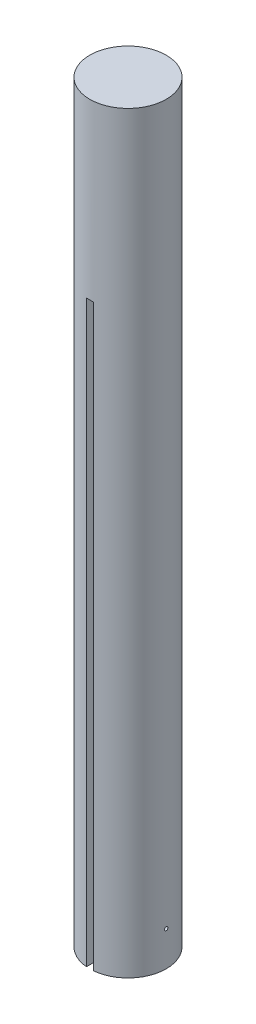
ISO-10303-21;
HEADER;
FILE_DESCRIPTION(('STEP AP214'),'2;1');
FILE_NAME('part.step','',(''),(''),'','','');
FILE_SCHEMA(('AUTOMOTIVE_DESIGN { 1 0 10303 214 1 1 1 1 }'));
ENDSEC;
DATA;
#1=APPLICATION_CONTEXT('core data for automotive mechanical design processes');
#2=APPLICATION_PROTOCOL_DEFINITION('international standard','automotive_design',2000,#1);
#3=PRODUCT_CONTEXT('',#1,'mechanical');
#4=PRODUCT('Part','Part','',(#3));
#5=PRODUCT_RELATED_PRODUCT_CATEGORY('part','',(#4));
#6=PRODUCT_DEFINITION_FORMATION('','',#4);
#7=PRODUCT_DEFINITION_CONTEXT('part definition',#1,'design');
#8=PRODUCT_DEFINITION('design','',#6,#7);
#9=PRODUCT_DEFINITION_SHAPE('','',#8);
#10=(LENGTH_UNIT() NAMED_UNIT(*) SI_UNIT(.MILLI.,.METRE.));
#11=(NAMED_UNIT(*) PLANE_ANGLE_UNIT() SI_UNIT($,.RADIAN.));
#12=(NAMED_UNIT(*) SI_UNIT($,.STERADIAN.) SOLID_ANGLE_UNIT());
#13=UNCERTAINTY_MEASURE_WITH_UNIT(LENGTH_MEASURE(1.E-05),#10,'distance_accuracy_value','');
#14=(GEOMETRIC_REPRESENTATION_CONTEXT(3) GLOBAL_UNCERTAINTY_ASSIGNED_CONTEXT((#13)) GLOBAL_UNIT_ASSIGNED_CONTEXT((#10,
#11,#12)) REPRESENTATION_CONTEXT('',''));
#15=CARTESIAN_POINT('',(0.,0.,0.));
#16=DIRECTION('',(0.,0.,1.));
#17=DIRECTION('',(1.,0.,0.));
#18=AXIS2_PLACEMENT_3D('',#15,#16,#17);
#19=CARTESIAN_POINT('',(0.,166.66667,0.));
#20=DIRECTION('',(0.,1.,0.));
#21=DIRECTION('',(0.,0.,1.));
#22=AXIS2_PLACEMENT_3D('',#19,#20,#21);
#23=PLANE('',#22);
#24=DIRECTION('',(0.,0.,-1.));
#25=VECTOR('',#24,1.);
#26=CARTESIAN_POINT('',(0.99999999999999,166.66667,0.));
#27=LINE('',#26,#25);
#28=CARTESIAN_POINT('',(0.99999999999999,166.66667,10.9544511501033));
#29=VERTEX_POINT('',#28);
#30=CARTESIAN_POINT('',(0.999999999999987,166.66667,-10.9544511501033));
#31=VERTEX_POINT('',#30);
#32=EDGE_CURVE('E11',#29,#31,#27,.T.);
#33=ORIENTED_EDGE('',*,*,#32,.F.);
#34=CARTESIAN_POINT('',(0.,166.66667,0.));
#35=DIRECTION('',(0.,1.,0.));
#36=DIRECTION('',(0.,0.,1.));
#37=AXIS2_PLACEMENT_3D('',#34,#35,#36);
#38=CIRCLE('',#37,11.);
#39=CARTESIAN_POINT('',(-1.00000000000001,166.66667,10.9544511501033));
#40=VERTEX_POINT('',#39);
#41=EDGE_CURVE('E144',#40,#29,#38,.T.);
#42=ORIENTED_EDGE('',*,*,#41,.F.);
#43=DIRECTION('',(0.,0.,-1.));
#44=VECTOR('',#43,1.);
#45=CARTESIAN_POINT('',(-1.00000000000001,166.66667,-11.));
#46=LINE('',#45,#44);
#47=CARTESIAN_POINT('',(-1.00000000000001,166.66667,-10.9544511501033));
#48=VERTEX_POINT('',#47);
#49=EDGE_CURVE('E55',#40,#48,#46,.T.);
#50=ORIENTED_EDGE('',*,*,#49,.T.);
#51=EDGE_CURVE('E67',#31,#48,#38,.T.);
#52=ORIENTED_EDGE('',*,*,#51,.F.);
#53=EDGE_LOOP('',(#33,#42,#50,#52));
#54=FACE_BOUND('',#53,.T.);
#55=ADVANCED_FACE('F45',(#54),#23,.F.);
#56=CARTESIAN_POINT('',(-1.00000000000001,216.66667,-11.));
#57=DIRECTION('',(-1.,0.,0.));
#58=DIRECTION('',(0.,-1.,0.));
#59=AXIS2_PLACEMENT_3D('',#56,#57,#58);
#60=PLANE('',#59);
#61=ORIENTED_EDGE('',*,*,#49,.F.);
#62=DIRECTION('',(0.,-1.,0.));
#63=VECTOR('',#62,1.);
#64=CARTESIAN_POINT('',(-1.00000000000001,216.66667,10.9544511501033));
#65=LINE('',#64,#63);
#66=CARTESIAN_POINT('',(-1.,0.,10.9544511501033));
#67=VERTEX_POINT('',#66);
#68=EDGE_CURVE('E158',#67,#40,#65,.F.);
#69=ORIENTED_EDGE('',*,*,#68,.F.);
#70=DIRECTION('',(0.,0.,1.));
#71=VECTOR('',#70,1.);
#72=CARTESIAN_POINT('',(-1.,0.,-11.));
#73=LINE('',#72,#71);
#74=CARTESIAN_POINT('',(-1.,0.,6.92820323027551));
#75=VERTEX_POINT('',#74);
#76=EDGE_CURVE('E147',#75,#67,#73,.T.);
#77=ORIENTED_EDGE('',*,*,#76,.F.);
#78=DIRECTION('',(0.,-1.,0.));
#79=VECTOR('',#78,1.);
#80=CARTESIAN_POINT('',(-1.,20.,6.92820323027551));
#81=LINE('',#80,#79);
#82=CARTESIAN_POINT('',(-1.,20.,6.92820323027551));
#83=VERTEX_POINT('',#82);
#84=EDGE_CURVE('E152',#75,#83,#81,.F.);
#85=ORIENTED_EDGE('',*,*,#84,.T.);
#86=DIRECTION('',(0.,0.,1.));
#87=VECTOR('',#86,1.);
#88=CARTESIAN_POINT('',(-1.,20.,0.));
#89=LINE('',#88,#87);
#90=CARTESIAN_POINT('',(-1.,20.,-6.92820323027551));
#91=VERTEX_POINT('',#90);
#92=EDGE_CURVE('E198',#91,#83,#89,.T.);
#93=ORIENTED_EDGE('',*,*,#92,.F.);
#94=DIRECTION('',(0.,-1.,0.));
#95=VECTOR('',#94,1.);
#96=CARTESIAN_POINT('',(-1.,20.,-6.92820323027551));
#97=LINE('',#96,#95);
#98=CARTESIAN_POINT('',(-1.,0.,-6.92820323027551));
#99=VERTEX_POINT('',#98);
#100=EDGE_CURVE('E155',#91,#99,#97,.T.);
#101=ORIENTED_EDGE('',*,*,#100,.T.);
#102=CARTESIAN_POINT('',(-1.,0.,-10.9544511501033));
#103=VERTEX_POINT('',#102);
#104=EDGE_CURVE('E151',#103,#99,#73,.T.);
#105=ORIENTED_EDGE('',*,*,#104,.F.);
#106=DIRECTION('',(0.,-1.,0.));
#107=VECTOR('',#106,1.);
#108=CARTESIAN_POINT('',(-1.00000000000001,216.66667,-10.9544511501033));
#109=LINE('',#108,#107);
#110=EDGE_CURVE('E162',#48,#103,#109,.T.);
#111=ORIENTED_EDGE('',*,*,#110,.F.);
#112=EDGE_LOOP('',(#61,#69,#77,#85,#93,#101,#105,#111));
#113=FACE_BOUND('',#112,.T.);
#114=ADVANCED_FACE('F183',(#113),#60,.F.);
#115=CARTESIAN_POINT('',(-11.,10.,0.));
#116=DIRECTION('',(1.,0.,0.));
#117=DIRECTION('',(0.,0.,-1.));
#118=AXIS2_PLACEMENT_3D('',#115,#116,#117);
#119=CYLINDRICAL_SURFACE('',#118,0.5);
#120=CARTESIAN_POINT('',(-6.98212002188447,10.,-0.5));
#121=CARTESIAN_POINT('',(-6.98212026019684,10.0280467568763,-0.499998769244178));
#122=CARTESIAN_POINT('',(-6.98229083321164,10.0561129379612,-0.497632204535513));
#123=CARTESIAN_POINT('',(-6.98295474085973,10.111469702785,-0.488225828593486));
#124=CARTESIAN_POINT('',(-6.98344844724258,10.1387593553861,-0.481180634683073));
#125=CARTESIAN_POINT('',(-6.98470241732412,10.1917532394701,-0.46262094681194));
#126=CARTESIAN_POINT('',(-6.98546253619947,10.217458323424,-0.451108880704623));
#127=CARTESIAN_POINT('',(-6.98716350167581,10.266564810098,-0.42394632109158));
#128=CARTESIAN_POINT('',(-6.98810430796363,10.2899667249199,-0.40829675041145));
#129=CARTESIAN_POINT('',(-6.99006267981786,10.3338540367072,-0.373270687165762));
#130=CARTESIAN_POINT('',(-6.99108037313231,10.3543344089305,-0.353887905249338));
#131=CARTESIAN_POINT('',(-6.99307666982089,10.3917541926016,-0.311958772798072));
#132=CARTESIAN_POINT('',(-6.99405527153302,10.4086934536265,-0.289412287940214));
#133=CARTESIAN_POINT('',(-6.99586427570959,10.438566211619,-0.241766646581247));
#134=CARTESIAN_POINT('',(-6.99669452070996,10.4514954629885,-0.216664821695315));
#135=CARTESIAN_POINT('',(-6.9981119033184,10.472954019596,-0.164639720829318));
#136=CARTESIAN_POINT('',(-6.99869904417823,10.4814833836872,-0.137716469218328));
#137=CARTESIAN_POINT('',(-6.99956317551645,10.4938858643815,-0.0828619346968116));
#138=CARTESIAN_POINT('',(-6.99984069832454,10.4977669736276,-0.054932467421988));
#139=CARTESIAN_POINT('',(-7.00005612169472,10.5007874671409,0.00118278070601034));
#140=CARTESIAN_POINT('',(-6.99999402706535,10.4999269185439,0.029368557924525));
#141=CARTESIAN_POINT('',(-6.99953765415375,10.4934950936711,0.0851421760802396));
#142=CARTESIAN_POINT('',(-6.99914398205092,10.4879324136158,0.112731013983813));
#143=CARTESIAN_POINT('',(-6.99806945593314,10.4722675803337,0.166582379213727));
#144=CARTESIAN_POINT('',(-6.99738859980816,10.4621653937534,0.192844896793534));
#145=CARTESIAN_POINT('',(-6.99581529622793,10.4376986375456,0.243325627021073));
#146=CARTESIAN_POINT('',(-6.99492265643054,10.4233301902953,0.267541954044168));
#147=CARTESIAN_POINT('',(-6.99302618810151,10.3907415982159,0.313222303766977));
#148=CARTESIAN_POINT('',(-6.99202235792308,10.3725213963366,0.334686285692684));
#149=CARTESIAN_POINT('',(-6.99001377364571,10.3326979895382,0.374302869122249));
#150=CARTESIAN_POINT('',(-6.98900902249019,10.311087320156,0.392447968185296));
#151=CARTESIAN_POINT('',(-6.98711410889444,10.2651225225752,0.424853822550418));
#152=CARTESIAN_POINT('',(-6.9862239465164,10.2407683928878,0.439114575744562));
#153=CARTESIAN_POINT('',(-6.98465877511779,10.1900030332037,0.463346491817701));
#154=CARTESIAN_POINT('',(-6.98398378339497,10.163591638034,0.473317309847772));
#155=CARTESIAN_POINT('',(-6.98292565515787,10.1094637840781,0.488680993922061));
#156=CARTESIAN_POINT('',(-6.98254251415107,10.0817473453878,0.494073930434823));
#157=CARTESIAN_POINT('',(-6.98211214327375,10.0258616959009,0.500119359653543));
#158=CARTESIAN_POINT('',(-6.98206417348304,9.99769362011582,0.500782294326562));
#159=CARTESIAN_POINT('',(-6.9823076204162,9.94164669874765,0.497376211665614));
#160=CARTESIAN_POINT('',(-6.98259903482474,9.91376785119272,0.493307226613501));
#161=CARTESIAN_POINT('',(-6.98348773690515,9.8591204685044,0.480561494259024));
#162=CARTESIAN_POINT('',(-6.98408470364616,9.83235080019215,0.47188958119827));
#163=CARTESIAN_POINT('',(-6.98551697215986,9.78064664207959,0.450189059868942));
#164=CARTESIAN_POINT('',(-6.98635227675284,9.7557121739999,0.437160400045965));
#165=CARTESIAN_POINT('',(-6.98816889099223,9.70833832047326,0.407089639890386));
#166=CARTESIAN_POINT('',(-6.98915045351666,9.68590337647051,0.390040557953417));
#167=CARTESIAN_POINT('',(-6.9911481055053,9.64421021613506,0.35242304464853));
#168=CARTESIAN_POINT('',(-6.99216419540784,9.62495204015023,0.331854568587816));
#169=CARTESIAN_POINT('',(-6.99411858955844,9.59012366709107,0.287737117260084));
#170=CARTESIAN_POINT('',(-6.99505674904584,9.57456023786159,0.264182791853267));
#171=CARTESIAN_POINT('',(-6.99674749336386,9.54760950654519,0.214789067826833));
#172=CARTESIAN_POINT('',(-6.99750007962143,9.53622217234633,0.18894968677996));
#173=CARTESIAN_POINT('',(-6.99873420077067,9.51795858984637,0.13574396901785));
#174=CARTESIAN_POINT('',(-6.99921599063627,9.51107809702254,0.108379095443338));
#175=CARTESIAN_POINT('',(-6.99985525867364,9.5020096256133,0.052878948661583));
#176=CARTESIAN_POINT('',(-7.00001274119515,9.4998215840907,0.0247436857922632));
#177=CARTESIAN_POINT('',(-6.99998566144827,9.5002007790722,-0.0314317103014885));
#178=CARTESIAN_POINT('',(-6.99980185973598,9.50275744193737,-0.0594719158770197));
#179=CARTESIAN_POINT('',(-6.99911437947149,9.51253149774485,-0.114723743333768));
#180=CARTESIAN_POINT('',(-6.99861070040063,9.51974889824412,-0.141935363871435));
#181=CARTESIAN_POINT('',(-6.99734003711329,9.53863703700059,-0.194758789707945));
#182=CARTESIAN_POINT('',(-6.99657305920753,9.55030766852392,-0.2203706333327));
#183=CARTESIAN_POINT('',(-6.99486179076899,9.57776965097329,-0.269272950537146));
#184=CARTESIAN_POINT('',(-6.99391750412449,9.59356091153917,-0.292563475004946));
#185=CARTESIAN_POINT('',(-6.99195524198601,9.62885535141929,-0.336215926305171));
#186=CARTESIAN_POINT('',(-6.99093711557054,9.64836627386057,-0.356571585645878));
#187=CARTESIAN_POINT('',(-6.98894317771428,9.69053387438338,-0.393726345843105));
#188=CARTESIAN_POINT('',(-6.98796737664557,9.71319131788803,-0.410524578801507));
#189=CARTESIAN_POINT('',(-6.98616697590803,9.76104171541481,-0.440104070755857));
#190=CARTESIAN_POINT('',(-6.98534260310901,9.78623838765042,-0.452879322648843));
#191=CARTESIAN_POINT('',(-6.98394123735022,9.83840709413575,-0.474002001315433));
#192=CARTESIAN_POINT('',(-6.98336395689531,9.86537702277909,-0.48235457662887));
#193=CARTESIAN_POINT('',(-6.98267232186361,9.91042474111922,-0.492240993453022));
#194=CARTESIAN_POINT('',(-6.98246614527858,9.92821188959728,-0.495146817248094));
#195=CARTESIAN_POINT('',(-6.98218991892011,9.96399669043415,-0.499026713772105));
#196=CARTESIAN_POINT('',(-6.98211986889099,9.98199434239751,-0.500000790129427));
#197=CARTESIAN_POINT('',(-6.98212002188447,10.,-0.5));
#198=B_SPLINE_CURVE_WITH_KNOTS('',3,(#120,#121,#122,#123,#124,#125,#126,#127,#128,#129,#130,
#131,#132,#133,#134,#135,#136,#137,#138,#139,#140,#141,#142,#143,#144,#145,#146,#147,#148,#149,
#150,#151,#152,#153,#154,#155,#156,#157,#158,#159,#160,#161,#162,#163,#164,#165,#166,#167,#168,
#169,#170,#171,#172,#173,#174,#175,#176,#177,#178,#179,#180,#181,#182,#183,#184,#185,#186,#187,
#188,#189,#190,#191,#192,#193,#194,#195,#196,#197),.UNSPECIFIED.,.T.,.F.,(4,2,2,2,2,2,2,2,2,2,2,
2,2,2,2,2,2,2,2,2,2,2,2,2,2,2,2,2,2,2,2,2,2,2,2,2,2,2,4),(0.,0.0840745348681494,
0.168245963905642,0.252371707669572,0.336478703903151,0.420728654807236,0.504982183839144,
0.589324614168666,0.673665916294283,0.757861984941225,0.842056861483251,0.926098148884886,
1.01014005377849,1.09425857977757,1.17837835178802,1.26268599047371,1.34699367491084,
1.43130813520442,1.51562129759962,1.59974827223689,1.68387467295091,1.76791289392929,
1.85195210938678,1.93613835076696,2.02032566130781,2.10466601202528,2.18900571419723,
2.27326587097592,2.35752489761365,2.44159637729523,2.52566799329151,2.60973759440808,
2.69380535213984,2.77805006119128,2.86231529963659,2.94670577250915,3.03099778728952,
3.08497265996376,3.13894743125739),.UNSPECIFIED.);
#199=CARTESIAN_POINT('',(-6.98212002188447,10.,-0.5));
#200=VERTEX_POINT('',#199);
#201=EDGE_CURVE('E165',#200,#200,#198,.T.);
#202=ORIENTED_EDGE('',*,*,#201,.T.);
#203=EDGE_LOOP('',(#202));
#204=FACE_BOUND('',#203,.T.);
#205=CARTESIAN_POINT('',(-11.,9.5,0.));
#206=CARTESIAN_POINT('',(-10.9999998476752,9.50000123989166,-0.0280696670615832));
#207=CARTESIAN_POINT('',(-10.9998914070264,9.50237165616131,-0.0561593179269098));
#208=CARTESIAN_POINT('',(-10.999469240749,9.51179422562756,-0.111563949604124));
#209=CARTESIAN_POINT('',(-10.9991552723474,9.51885191565988,-0.138877974371884));
#210=CARTESIAN_POINT('',(-10.9983575919794,9.5374467456215,-0.191920731567463));
#211=CARTESIAN_POINT('',(-10.9978739655923,9.54898162746663,-0.217650255575222));
#212=CARTESIAN_POINT('',(-10.9967914600302,9.5761999996941,-0.266800788930916));
#213=CARTESIAN_POINT('',(-10.9961926083225,9.59188250170554,-0.290222346440657));
#214=CARTESIAN_POINT('',(-10.9949464604806,9.62696607748239,-0.334119273299177));
#215=CARTESIAN_POINT('',(-10.9942991284087,9.6463699268029,-0.35459242350515));
#216=CARTESIAN_POINT('',(-10.9930292893068,9.68833995043937,-0.391992503052774));
#217=CARTESIAN_POINT('',(-10.9924067832848,9.7109062529825,-0.408919288531432));
#218=CARTESIAN_POINT('',(-10.9912565505831,9.75857176234532,-0.438751888226723));
#219=CARTESIAN_POINT('',(-10.9907288634269,9.78367201861702,-0.451656027321173));
#220=CARTESIAN_POINT('',(-10.9898281967574,9.83568553090696,-0.473066268774109));
#221=CARTESIAN_POINT('',(-10.9894552162206,9.86259877492908,-0.48157240022996));
#222=CARTESIAN_POINT('',(-10.9889063379423,9.91745439865735,-0.493939462299893));
#223=CARTESIAN_POINT('',(-10.9887303028871,9.94539604728535,-0.49780362950936));
#224=CARTESIAN_POINT('',(-10.9885947536741,10.0015319219197,-0.500787057182346));
#225=CARTESIAN_POINT('',(-10.9886352380367,10.0297261461988,-0.499906350069034));
#226=CARTESIAN_POINT('',(-10.9889280346302,10.0855448568778,-0.493427730828099));
#227=CARTESIAN_POINT('',(-10.9891801898671,10.1131697499903,-0.487833314791565));
#228=CARTESIAN_POINT('',(-10.9898676592518,10.1670879042217,-0.472091498543146));
#229=CARTESIAN_POINT('',(-10.9903029740733,10.1933811604421,-0.461944081584222));
#230=CARTESIAN_POINT('',(-10.991307877594,10.2439009393438,-0.43738031223604));
#231=CARTESIAN_POINT('',(-10.9918775164868,10.2681266848262,-0.422962363535038));
#232=CARTESIAN_POINT('',(-10.9930868097454,10.3138152581022,-0.390267969802853));
#233=CARTESIAN_POINT('',(-10.9937264645146,10.3352780699688,-0.371991502530567));
#234=CARTESIAN_POINT('',(-10.995004388807,10.3748518771977,-0.332079132259393));
#235=CARTESIAN_POINT('',(-10.9956426565502,10.3929598185921,-0.310440201001414));
#236=CARTESIAN_POINT('',(-10.9968453058533,10.4252863400157,-0.264427804651654));
#237=CARTESIAN_POINT('',(-10.9974096873969,10.4395049191904,-0.240054338959133));
#238=CARTESIAN_POINT('',(-10.9984009736625,10.4636487981854,-0.189262982832602));
#239=CARTESIAN_POINT('',(-10.9988278750625,10.4735739942649,-0.162845043016198));
#240=CARTESIAN_POINT('',(-10.9994960363009,10.4888473839079,-0.108715430609826));
#241=CARTESIAN_POINT('',(-10.9997372972891,10.4941956058198,-0.0810037660339233));
#242=CARTESIAN_POINT('',(-11.0000068380985,10.5001594727011,-0.0250998552296095));
#243=CARTESIAN_POINT('',(-11.0000353080437,10.5007793423576,0.00309193943089153));
#244=CARTESIAN_POINT('',(-10.9998765624759,10.4972799297424,0.059179156394283));
#245=CARTESIAN_POINT('',(-10.9996893475503,10.4931606603787,0.08707457950419));
#246=CARTESIAN_POINT('',(-10.9991204445932,10.4803033971359,0.141765383914923));
#247=CARTESIAN_POINT('',(-10.9987388376629,10.4715673293504,0.168561218935548));
#248=CARTESIAN_POINT('',(-10.9978241244924,10.4497264065862,0.220306177645901));
#249=CARTESIAN_POINT('',(-10.9972910175329,10.4366215308706,0.245255292569307));
#250=CARTESIAN_POINT('',(-10.9961328248827,10.4064041573666,0.292618009769469));
#251=CARTESIAN_POINT('',(-10.9955076742404,10.3892888244715,0.315029801639206));
#252=CARTESIAN_POINT('',(-10.9942360288221,10.3515405255442,0.356663487113432));
#253=CARTESIAN_POINT('',(-10.9935895339317,10.330907540643,0.375885363605795));
#254=CARTESIAN_POINT('',(-10.9923475292544,10.2866914759295,0.410607773769962));
#255=CARTESIAN_POINT('',(-10.9917520570919,10.2631062501239,0.426105576227515));
#256=CARTESIAN_POINT('',(-10.9906798339263,10.2136660669612,0.452921247971502));
#257=CARTESIAN_POINT('',(-10.9902030824736,10.1878111181985,0.464239133084648));
#258=CARTESIAN_POINT('',(-10.9894223279379,10.1345755790689,0.482368926012198));
#259=CARTESIAN_POINT('',(-10.9891182578443,10.1071955850451,0.489182581902234));
#260=CARTESIAN_POINT('',(-10.9887169647898,10.0516788055641,0.498116221909794));
#261=CARTESIAN_POINT('',(-10.9886197409245,10.0235420234167,0.500236226551729));
#262=CARTESIAN_POINT('',(-10.9886431273481,9.96733757419881,0.499722182030805));
#263=CARTESIAN_POINT('',(-10.9887635406918,9.93926986763349,0.497092431037246));
#264=CARTESIAN_POINT('',(-10.9892082135313,9.88397485417319,0.487162399599012));
#265=CARTESIAN_POINT('',(-10.9895324734204,9.85674754890014,0.479862110141091));
#266=CARTESIAN_POINT('',(-10.9903482485113,9.80390520953246,0.460799066713202));
#267=CARTESIAN_POINT('',(-10.990839765491,9.77829019257985,0.449036265306708));
#268=CARTESIAN_POINT('',(-10.9919346368567,9.72939850027769,0.421382930748162));
#269=CARTESIAN_POINT('',(-10.9925379876452,9.70612174975038,0.405492530361756));
#270=CARTESIAN_POINT('',(-10.9937891346432,9.66254606348042,0.370019990821217));
#271=CARTESIAN_POINT('',(-10.9944369658659,9.64224951400883,0.35043492167403));
#272=CARTESIAN_POINT('',(-10.9957038402634,9.60522628449539,0.308129673600482));
#273=CARTESIAN_POINT('',(-10.9963228763044,9.58850048543778,0.285408723253286));
#274=CARTESIAN_POINT('',(-10.9974627675982,9.55908708424268,0.237461289124394));
#275=CARTESIAN_POINT('',(-10.9979835366351,9.54640302152089,0.2122326345265));
#276=CARTESIAN_POINT('',(-10.9988668652817,9.52546573744016,0.160020508571457));
#277=CARTESIAN_POINT('',(-10.9992296121515,9.51720726895925,0.133039158031197));
#278=CARTESIAN_POINT('',(-10.9996598037402,9.5075278919053,0.0882411671930399));
#279=CARTESIAN_POINT('',(-10.9997868186179,9.50470852233493,0.0707148632049552));
#280=CARTESIAN_POINT('',(-10.9999569648391,9.50094418534465,0.0354616984978808));
#281=CARTESIAN_POINT('',(-11.0000000962411,9.4999992166178,0.0177348379187399));
#282=CARTESIAN_POINT('',(-11.,9.5,0.));
#283=B_SPLINE_CURVE_WITH_KNOTS('',3,(#205,#206,#207,#208,#209,#210,#211,#212,#213,#214,#215,
#216,#217,#218,#219,#220,#221,#222,#223,#224,#225,#226,#227,#228,#229,#230,#231,#232,#233,#234,
#235,#236,#237,#238,#239,#240,#241,#242,#243,#244,#245,#246,#247,#248,#249,#250,#251,#252,#253,
#254,#255,#256,#257,#258,#259,#260,#261,#262,#263,#264,#265,#266,#267,#268,#269,#270,#271,#272,
#273,#274,#275,#276,#277,#278,#279,#280,#281,#282),.UNSPECIFIED.,.T.,.F.,(4,2,2,2,2,2,2,2,2,2,2,
2,2,2,2,2,2,2,2,2,2,2,2,2,2,2,2,2,2,2,2,2,2,2,2,2,2,2,4),(0.,0.0841442635924437,
0.168388099689155,0.252589502266655,0.336770857842751,0.421015245724372,0.505263050430004,
0.589545891132659,0.673828174210091,0.758051657551128,0.842274565368223,0.926435061179829,
1.01059586655665,1.09478817077267,1.17898096029952,1.26325001868069,1.34751909557465,
1.4317902085464,1.51606079956435,1.60025608768573,1.68445114648545,1.76861110743419,
1.85277146786198,1.93699150411046,2.02121199213814,2.10549405974592,2.18977580822734,
2.27402482802329,2.35827347941414,2.44244593034644,2.52661854371598,2.61079205186594,
2.69496285288118,2.77920068685278,2.86345928023004,2.94779145875712,3.03202342796633,
3.08518707660677,3.13835068817828),.UNSPECIFIED.);
#284=CARTESIAN_POINT('',(-11.,9.5,0.));
#285=VERTEX_POINT('',#284);
#286=EDGE_CURVE('E166',#285,#285,#283,.T.);
#287=ORIENTED_EDGE('',*,*,#286,.F.);
#288=EDGE_LOOP('',(#287));
#289=FACE_BOUND('',#288,.T.);
#290=ADVANCED_FACE('F177',(#204,#289),#119,.F.);
#291=CARTESIAN_POINT('',(0.,20.,0.));
#292=DIRECTION('',(0.,1.,0.));
#293=DIRECTION('',(0.,0.,1.));
#294=AXIS2_PLACEMENT_3D('',#291,#292,#293);
#295=PLANE('',#294);
#296=CARTESIAN_POINT('',(0.,20.,0.));
#297=DIRECTION('',(0.,1.,0.));
#298=DIRECTION('',(0.,0.,1.));
#299=AXIS2_PLACEMENT_3D('',#296,#297,#298);
#300=CIRCLE('',#299,7.);
#301=EDGE_CURVE('E175',#91,#83,#300,.T.);
#302=ORIENTED_EDGE('',*,*,#301,.F.);
#303=ORIENTED_EDGE('',*,*,#92,.T.);
#304=EDGE_LOOP('',(#302,#303));
#305=FACE_BOUND('',#304,.T.);
#306=ADVANCED_FACE('F182',(#305),#295,.F.);
#307=CARTESIAN_POINT('',(0.,20.,0.));
#308=DIRECTION('',(0.,-1.,0.));
#309=DIRECTION('',(0.,0.,-1.));
#310=AXIS2_PLACEMENT_3D('',#307,#308,#309);
#311=CYLINDRICAL_SURFACE('',#310,7.);
#312=ORIENTED_EDGE('',*,*,#100,.F.);
#313=ORIENTED_EDGE('',*,*,#301,.T.);
#314=ORIENTED_EDGE('',*,*,#84,.F.);
#315=CARTESIAN_POINT('',(0.,0.,0.));
#316=DIRECTION('',(0.,1.,0.));
#317=DIRECTION('',(0.,0.,1.));
#318=AXIS2_PLACEMENT_3D('',#315,#316,#317);
#319=CIRCLE('',#318,7.);
#320=EDGE_CURVE('E174',#99,#75,#319,.T.);
#321=ORIENTED_EDGE('',*,*,#320,.F.);
#322=EDGE_LOOP('',(#312,#313,#314,#321));
#323=FACE_BOUND('',#322,.T.);
#324=ORIENTED_EDGE('',*,*,#201,.F.);
#325=EDGE_LOOP('',(#324));
#326=FACE_BOUND('',#325,.T.);
#327=ADVANCED_FACE('F199',(#323,#326),#311,.F.);
#328=CARTESIAN_POINT('',(0.,0.,0.));
#329=DIRECTION('',(0.,1.,0.));
#330=DIRECTION('',(0.,0.,1.));
#331=AXIS2_PLACEMENT_3D('',#328,#329,#330);
#332=PLANE('',#331);
#333=CARTESIAN_POINT('',(0.,0.,0.));
#334=DIRECTION('',(0.,1.,0.));
#335=DIRECTION('',(0.,0.,1.));
#336=AXIS2_PLACEMENT_3D('',#333,#334,#335);
#337=CIRCLE('',#336,11.);
#338=EDGE_CURVE('E196',#103,#67,#337,.T.);
#339=ORIENTED_EDGE('',*,*,#338,.F.);
#340=ORIENTED_EDGE('',*,*,#104,.T.);
#341=ORIENTED_EDGE('',*,*,#320,.T.);
#342=ORIENTED_EDGE('',*,*,#76,.T.);
#343=EDGE_LOOP('',(#339,#340,#341,#342));
#344=FACE_BOUND('',#343,.T.);
#345=ADVANCED_FACE('F203',(#344),#332,.F.);
#346=CARTESIAN_POINT('',(0.,216.66667,0.));
#347=DIRECTION('',(0.,1.,0.));
#348=DIRECTION('',(0.,0.,1.));
#349=AXIS2_PLACEMENT_3D('',#346,#347,#348);
#350=PLANE('',#349);
#351=CARTESIAN_POINT('',(0.,216.66667,0.));
#352=DIRECTION('',(0.,1.,0.));
#353=DIRECTION('',(0.,0.,1.));
#354=AXIS2_PLACEMENT_3D('',#351,#352,#353);
#355=CIRCLE('',#354,11.);
#356=CARTESIAN_POINT('',(0.,216.66667,11.));
#357=VERTEX_POINT('',#356);
#358=EDGE_CURVE('E255',#357,#357,#355,.T.);
#359=ORIENTED_EDGE('',*,*,#358,.T.);
#360=EDGE_LOOP('',(#359));
#361=FACE_BOUND('',#360,.T.);
#362=ADVANCED_FACE('F205',(#361),#350,.T.);
#363=CARTESIAN_POINT('',(0.,216.66667,0.));
#364=DIRECTION('',(0.,-1.,0.));
#365=DIRECTION('',(0.,0.,-1.));
#366=AXIS2_PLACEMENT_3D('',#363,#364,#365);
#367=CYLINDRICAL_SURFACE('',#366,11.);
#368=ORIENTED_EDGE('',*,*,#41,.T.);
#369=DIRECTION('',(0.,-1.,0.));
#370=VECTOR('',#369,1.);
#371=CARTESIAN_POINT('',(0.999999999999987,216.66667,10.9544511501033));
#372=LINE('',#371,#370);
#373=CARTESIAN_POINT('',(1.,0.,10.9544511501033));
#374=VERTEX_POINT('',#373);
#375=EDGE_CURVE('E263',#29,#374,#372,.T.);
#376=ORIENTED_EDGE('',*,*,#375,.T.);
#377=CARTESIAN_POINT('',(0.,0.,0.));
#378=DIRECTION('',(0.,1.,0.));
#379=DIRECTION('',(0.,0.,1.));
#380=AXIS2_PLACEMENT_3D('',#377,#378,#379);
#381=CIRCLE('',#380,11.);
#382=CARTESIAN_POINT('',(1.,0.,-10.9544511501033));
#383=VERTEX_POINT('',#382);
#384=EDGE_CURVE('E141',#374,#383,#381,.T.);
#385=ORIENTED_EDGE('',*,*,#384,.T.);
#386=DIRECTION('',(0.,-1.,0.));
#387=VECTOR('',#386,1.);
#388=CARTESIAN_POINT('',(0.999999999999987,216.66667,-10.9544511501033));
#389=LINE('',#388,#387);
#390=EDGE_CURVE('E138',#383,#31,#389,.F.);
#391=ORIENTED_EDGE('',*,*,#390,.T.);
#392=ORIENTED_EDGE('',*,*,#51,.T.);
#393=ORIENTED_EDGE('',*,*,#110,.T.);
#394=ORIENTED_EDGE('',*,*,#338,.T.);
#395=ORIENTED_EDGE('',*,*,#68,.T.);
#396=EDGE_LOOP('',(#368,#376,#385,#391,#392,#393,#394,#395));
#397=FACE_BOUND('',#396,.T.);
#398=ORIENTED_EDGE('',*,*,#358,.F.);
#399=EDGE_LOOP('',(#398));
#400=FACE_BOUND('',#399,.T.);
#401=CARTESIAN_POINT('',(10.988630487918,10.,-0.5));
#402=CARTESIAN_POINT('',(10.9886306408345,9.97193034983113,-0.499998760092987));
#403=CARTESIAN_POINT('',(10.9887391965362,9.94384071580074,-0.497628346579886));
#404=CARTESIAN_POINT('',(10.9891617738135,9.888436119104,-0.488205789059037));
#405=CARTESIAN_POINT('',(10.9894760383788,9.86112211249496,-0.481148108158415));
#406=CARTESIAN_POINT('',(10.9902743615562,9.8080793936829,-0.462553304914381));
#407=CARTESIAN_POINT('',(10.9907583345468,9.78234988974613,-0.4510184410909));
#408=CARTESIAN_POINT('',(10.9918414321081,9.73319938996731,-0.423800111292425));
#409=CARTESIAN_POINT('',(10.9924405292368,9.70977784598893,-0.408117633643569));
#410=CARTESIAN_POINT('',(10.9936869605086,9.66588090363478,-0.373034082386176));
#411=CARTESIAN_POINT('',(10.9943343305035,9.64540772873946,-0.353630227788665));
#412=CARTESIAN_POINT('',(10.9956040202434,9.60800760160283,-0.311660183260954));
#413=CARTESIAN_POINT('',(10.9962263389719,9.59108079314889,-0.2890938651706));
#414=CARTESIAN_POINT('',(10.9973760532387,9.56124816959669,-0.241428342400779));
#415=CARTESIAN_POINT('',(10.9979034092951,9.54834402535394,-0.216328090940845));
#416=CARTESIAN_POINT('',(10.9988034158249,9.52693377305225,-0.164314589114392));
#417=CARTESIAN_POINT('',(10.9991760673197,9.51842763595843,-0.137401350718222));
#418=CARTESIAN_POINT('',(10.9997244342223,9.50606056185759,-0.0825457433423356));
#419=CARTESIAN_POINT('',(10.999900286859,9.50219638784753,-0.0546041055311855));
#420=CARTESIAN_POINT('',(11.000035697704,9.49921294282645,0.00153174798859752));
#421=CARTESIAN_POINT('',(10.9999952573869,9.50009363946396,0.0297259619738076));
#422=CARTESIAN_POINT('',(10.9997027557701,9.50657224230169,0.0855447193423352));
#423=CARTESIAN_POINT('',(10.9994508508378,9.51216666295108,0.113169668208691));
#424=CARTESIAN_POINT('',(10.9987639785037,9.52790850782266,0.167087931572279));
#425=CARTESIAN_POINT('',(10.9983290104327,9.53805594868914,0.193381241201094));
#426=CARTESIAN_POINT('',(10.9973247459029,9.56261976716098,0.243901084134412));
#427=CARTESIAN_POINT('',(10.9967553994074,9.57703773543751,0.268126842985995));
#428=CARTESIAN_POINT('',(10.9955465079848,9.609732170748,0.313815434662401));
#429=CARTESIAN_POINT('',(10.9949069626528,9.6280086600354,0.335278251551224));
#430=CARTESIAN_POINT('',(10.9936290272824,9.66792104569923,0.374852033232831));
#431=CARTESIAN_POINT('',(10.9929906388124,9.68955996589779,0.39295994852176));
#432=CARTESIAN_POINT('',(10.9917875696884,9.73557233090051,0.425286422576581));
#433=CARTESIAN_POINT('',(10.9912228890516,9.75994577634218,0.439504980435741));
#434=CARTESIAN_POINT('',(10.9902309566139,9.81073712746126,0.463648844177506));
#435=CARTESIAN_POINT('',(10.9898037083472,9.83715508569368,0.473574039654291));
#436=CARTESIAN_POINT('',(10.9891349587148,9.89128473805715,0.488847422427505));
#437=CARTESIAN_POINT('',(10.9888934561942,9.91899642414334,0.494195638181199));
#438=CARTESIAN_POINT('',(10.9886236441244,9.9749003441888,0.500159481912648));
#439=CARTESIAN_POINT('',(10.9885951439986,10.0030921259537,0.500779340437574));
#440=CARTESIAN_POINT('',(10.9887540531531,10.0591793144349,0.497279910164288));
#441=CARTESIAN_POINT('',(10.9889414618454,10.0870747219582,0.493160634272868));
#442=CARTESIAN_POINT('',(10.9895108909883,10.1417654527034,0.480303373583729));
#443=CARTESIAN_POINT('',(10.9898928300031,10.1685612311927,0.471567321440484));
#444=CARTESIAN_POINT('',(10.9908082004387,10.2203060837821,0.44972644894136));
#445=CARTESIAN_POINT('',(10.9913416325819,10.2452551490771,0.436621607757152));
#446=CARTESIAN_POINT('',(10.9925003279132,10.2926178336452,0.406404284405434));
#447=CARTESIAN_POINT('',(10.9931256561483,10.3150296369042,0.389288958344303));
#448=CARTESIAN_POINT('',(10.9943974300781,10.3566633485511,0.351540666664192));
#449=CARTESIAN_POINT('',(10.9950438758858,10.3758852398755,0.33090768222958));
#450=CARTESIAN_POINT('',(10.9962855771542,10.4106076804087,0.286691610802186));
#451=CARTESIAN_POINT('',(10.9968807948398,10.4261054983651,0.263106377780338));
#452=CARTESIAN_POINT('',(10.9979524150765,10.4529211973388,0.213666176211488));
#453=CARTESIAN_POINT('',(10.9984288180774,10.4642390941835,0.187811216259249));
#454=CARTESIAN_POINT('',(10.999208934329,10.4823688952495,0.134575685559955));
#455=CARTESIAN_POINT('',(10.9995127147617,10.489182552619,0.107195712885509));
#456=CARTESIAN_POINT('',(10.9999136148619,10.4981162028256,0.0516789782946115));
#457=CARTESIAN_POINT('',(11.0000107354283,10.5002362160742,0.0235422196697678));
#458=CARTESIAN_POINT('',(10.9999873742469,10.4997221959396,-0.0326622456774284));
#459=CARTESIAN_POINT('',(10.9998670887664,10.4970924504889,-0.0607299917982195));
#460=CARTESIAN_POINT('',(10.9994228461976,10.4871624161869,-0.116025085710192));
#461=CARTESIAN_POINT('',(10.9990988887193,10.4798621183935,-0.143252431892242));
#462=CARTESIAN_POINT('',(10.9982837606281,10.4607990436607,-0.1960948507006));
#463=CARTESIAN_POINT('',(10.9977925882378,10.4490362192831,-0.221709906184275));
#464=CARTESIAN_POINT('',(10.9966982973532,10.4213828269136,-0.270601665911247));
#465=CARTESIAN_POINT('',(10.996095182461,10.4054923917291,-0.293878445355933));
#466=CARTESIAN_POINT('',(10.9948442968689,10.370019814716,-0.337454128026966));
#467=CARTESIAN_POINT('',(10.994196491082,10.3504347507945,-0.357750651408519));
#468=CARTESIAN_POINT('',(10.9929294444368,10.3081295237939,-0.394773830732595));
#469=CARTESIAN_POINT('',(10.992310210658,10.2854085892375,-0.411499605623785));
#470=CARTESIAN_POINT('',(10.9911697864303,10.2374611671538,-0.440912981719156));
#471=CARTESIAN_POINT('',(10.9906486821896,10.2122325060012,-0.453597038922565));
#472=CARTESIAN_POINT('',(10.9897646943046,10.1600203659873,-0.474534310852451));
#473=CARTESIAN_POINT('',(10.9894016233843,10.1330390079794,-0.482792772787898));
#474=CARTESIAN_POINT('',(10.9889710270666,10.0882410347435,-0.492472130814624));
#475=CARTESIAN_POINT('',(10.988843885798,10.0707147571692,-0.495291491839067));
#476=CARTESIAN_POINT('',(10.9886735679456,10.0354616454192,-0.499055817471611));
#477=CARTESIAN_POINT('',(10.9886303913031,10.0177348113838,-0.500000783391203));
#478=CARTESIAN_POINT('',(10.988630487918,10.,-0.5));
#479=B_SPLINE_CURVE_WITH_KNOTS('',3,(#401,#402,#403,#404,#405,#406,#407,#408,#409,#410,#411,
#412,#413,#414,#415,#416,#417,#418,#419,#420,#421,#422,#423,#424,#425,#426,#427,#428,#429,#430,
#431,#432,#433,#434,#435,#436,#437,#438,#439,#440,#441,#442,#443,#444,#445,#446,#447,#448,#449,
#450,#451,#452,#453,#454,#455,#456,#457,#458,#459,#460,#461,#462,#463,#464,#465,#466,#467,#468,
#469,#470,#471,#472,#473,#474,#475,#476,#477,#478),.UNSPECIFIED.,.T.,.F.,(4,2,2,2,2,2,2,2,2,2,2,
2,2,2,2,2,2,2,2,2,2,2,2,2,2,2,2,2,2,2,2,2,2,2,2,2,2,2,4),(0.,0.0841442128600546,
0.168387999329543,0.252589344042456,0.336770642644111,0.421015096889708,0.505262966164764,
0.589545782188115,0.673828041783952,0.758051494234729,0.842274372434036,0.92643502684802,
1.01059598892765,1.09478833849561,1.17898117364353,1.26325016603962,1.34751917808144,
1.43179035701149,1.51606101198364,1.60025625961515,1.68445127794573,1.76861107881589,
1.8527712809261,1.93699134384521,2.02121185726384,2.10549395115199,2.18977572590329,
2.27402467700673,2.35827326173226,2.44244582750093,2.52661855442661,2.61079217616513,
2.69496308992517,2.77920085595452,2.86345938296345,2.94779159046717,3.03202358697711,
3.085187156144,3.13835068811301),.UNSPECIFIED.);
#480=CARTESIAN_POINT('',(10.988630487918,10.,-0.5));
#481=VERTEX_POINT('',#480);
#482=EDGE_CURVE('E234',#481,#481,#479,.T.);
#483=ORIENTED_EDGE('',*,*,#482,.T.);
#484=EDGE_LOOP('',(#483));
#485=FACE_BOUND('',#484,.T.);
#486=ORIENTED_EDGE('',*,*,#286,.T.);
#487=EDGE_LOOP('',(#486));
#488=FACE_BOUND('',#487,.T.);
#489=ADVANCED_FACE('F47',(#397,#400,#485,#488),#367,.T.);
#490=CARTESIAN_POINT('',(0.999999999999987,216.66667,-11.));
#491=DIRECTION('',(1.,0.,0.));
#492=DIRECTION('',(0.,1.,0.));
#493=AXIS2_PLACEMENT_3D('',#490,#491,#492);
#494=PLANE('',#493);
#495=ORIENTED_EDGE('',*,*,#375,.F.);
#496=ORIENTED_EDGE('',*,*,#32,.T.);
#497=ORIENTED_EDGE('',*,*,#390,.F.);
#498=DIRECTION('',(0.,0.,1.));
#499=VECTOR('',#498,1.);
#500=CARTESIAN_POINT('',(1.,0.,-11.));
#501=LINE('',#500,#499);
#502=CARTESIAN_POINT('',(1.,0.,-6.92820323027551));
#503=VERTEX_POINT('',#502);
#504=EDGE_CURVE('E117',#383,#503,#501,.T.);
#505=ORIENTED_EDGE('',*,*,#504,.T.);
#506=DIRECTION('',(0.,-1.,0.));
#507=VECTOR('',#506,1.);
#508=CARTESIAN_POINT('',(0.999999999999999,20.,-6.92820323027551));
#509=LINE('',#508,#507);
#510=CARTESIAN_POINT('',(0.999999999999999,20.,-6.92820323027551));
#511=VERTEX_POINT('',#510);
#512=EDGE_CURVE('E110',#503,#511,#509,.F.);
#513=ORIENTED_EDGE('',*,*,#512,.T.);
#514=DIRECTION('',(0.,0.,-1.));
#515=VECTOR('',#514,1.);
#516=CARTESIAN_POINT('',(0.999999999999999,20.,0.));
#517=LINE('',#516,#515);
#518=CARTESIAN_POINT('',(0.999999999999999,20.,6.92820323027551));
#519=VERTEX_POINT('',#518);
#520=EDGE_CURVE('E114',#519,#511,#517,.T.);
#521=ORIENTED_EDGE('',*,*,#520,.F.);
#522=DIRECTION('',(0.,-1.,0.));
#523=VECTOR('',#522,1.);
#524=CARTESIAN_POINT('',(0.999999999999999,20.,6.92820323027551));
#525=LINE('',#524,#523);
#526=CARTESIAN_POINT('',(1.,0.,6.92820323027551));
#527=VERTEX_POINT('',#526);
#528=EDGE_CURVE('E123',#519,#527,#525,.T.);
#529=ORIENTED_EDGE('',*,*,#528,.T.);
#530=EDGE_CURVE('E272',#527,#374,#501,.T.);
#531=ORIENTED_EDGE('',*,*,#530,.T.);
#532=EDGE_LOOP('',(#495,#496,#497,#505,#513,#521,#529,#531));
#533=FACE_BOUND('',#532,.T.);
#534=ADVANCED_FACE('F113',(#533),#494,.F.);
#535=CARTESIAN_POINT('',(0.,0.,0.));
#536=DIRECTION('',(0.,1.,0.));
#537=DIRECTION('',(0.,0.,1.));
#538=AXIS2_PLACEMENT_3D('',#535,#536,#537);
#539=PLANE('',#538);
#540=ORIENTED_EDGE('',*,*,#384,.F.);
#541=ORIENTED_EDGE('',*,*,#530,.F.);
#542=CARTESIAN_POINT('',(0.,0.,0.));
#543=DIRECTION('',(0.,1.,0.));
#544=DIRECTION('',(0.,0.,1.));
#545=AXIS2_PLACEMENT_3D('',#542,#543,#544);
#546=CIRCLE('',#545,7.);
#547=EDGE_CURVE('E135',#527,#503,#546,.T.);
#548=ORIENTED_EDGE('',*,*,#547,.T.);
#549=ORIENTED_EDGE('',*,*,#504,.F.);
#550=EDGE_LOOP('',(#540,#541,#548,#549));
#551=FACE_BOUND('',#550,.T.);
#552=ADVANCED_FACE('F219',(#551),#539,.F.);
#553=CARTESIAN_POINT('',(0.,20.,0.));
#554=DIRECTION('',(0.,-1.,0.));
#555=DIRECTION('',(0.,0.,-1.));
#556=AXIS2_PLACEMENT_3D('',#553,#554,#555);
#557=CYLINDRICAL_SURFACE('',#556,7.);
#558=ORIENTED_EDGE('',*,*,#528,.F.);
#559=CARTESIAN_POINT('',(0.,20.,0.));
#560=DIRECTION('',(0.,1.,0.));
#561=DIRECTION('',(0.,0.,1.));
#562=AXIS2_PLACEMENT_3D('',#559,#560,#561);
#563=CIRCLE('',#562,7.);
#564=EDGE_CURVE('E128',#519,#511,#563,.T.);
#565=ORIENTED_EDGE('',*,*,#564,.T.);
#566=ORIENTED_EDGE('',*,*,#512,.F.);
#567=ORIENTED_EDGE('',*,*,#547,.F.);
#568=EDGE_LOOP('',(#558,#565,#566,#567));
#569=FACE_BOUND('',#568,.T.);
#570=CARTESIAN_POINT('',(6.98212002188447,10.,-0.5));
#571=CARTESIAN_POINT('',(6.98212026019684,9.97195324312374,-0.499998769244178));
#572=CARTESIAN_POINT('',(6.98229083321164,9.94388706203882,-0.497632204535513));
#573=CARTESIAN_POINT('',(6.98295474085973,9.88853029721503,-0.488225828593486));
#574=CARTESIAN_POINT('',(6.98344844724258,9.86124064461387,-0.481180634683073));
#575=CARTESIAN_POINT('',(6.98470241732412,9.80824676052993,-0.462620946811939));
#576=CARTESIAN_POINT('',(6.98546253619947,9.78254167657601,-0.451108880704621));
#577=CARTESIAN_POINT('',(6.98716350167581,9.73343518990198,-0.423946321091578));
#578=CARTESIAN_POINT('',(6.98810430796363,9.71003327508012,-0.408296750411449));
#579=CARTESIAN_POINT('',(6.99006267981786,9.66614596329282,-0.373270687165762));
#580=CARTESIAN_POINT('',(6.99108037313231,9.64566559106952,-0.353887905249338));
#581=CARTESIAN_POINT('',(6.99307666982089,9.60824580739842,-0.311958772798072));
#582=CARTESIAN_POINT('',(6.99405527153302,9.59130654637353,-0.289412287940214));
#583=CARTESIAN_POINT('',(6.99586427570959,9.56143378838103,-0.241766646581247));
#584=CARTESIAN_POINT('',(6.99669452070996,9.54850453701147,-0.216664821695315));
#585=CARTESIAN_POINT('',(6.9981119033184,9.52704598040405,-0.164639720829318));
#586=CARTESIAN_POINT('',(6.99869904417823,9.51851661631277,-0.137716469218328));
#587=CARTESIAN_POINT('',(6.99956317551645,9.5061141356185,-0.0828619346968116));
#588=CARTESIAN_POINT('',(6.99984069832454,9.5022330263724,-0.0549324674219879));
#589=CARTESIAN_POINT('',(7.00005612169472,9.4992125328591,0.00118278070601037));
#590=CARTESIAN_POINT('',(6.99999402706535,9.50007308145613,0.029368557924525));
#591=CARTESIAN_POINT('',(6.99953765415375,9.5065049063289,0.0851421760802397));
#592=CARTESIAN_POINT('',(6.99914398205092,9.51206758638416,0.112731013983813));
#593=CARTESIAN_POINT('',(6.99806945593314,9.52773241966629,0.166582379213727));
#594=CARTESIAN_POINT('',(6.99738859980816,9.53783460624657,0.192844896793534));
#595=CARTESIAN_POINT('',(6.99581529622793,9.56230136245439,0.243325627021073));
#596=CARTESIAN_POINT('',(6.99492265643054,9.57666980970474,0.267541954044168));
#597=CARTESIAN_POINT('',(6.99302618810151,9.60925840178406,0.313222303766977));
#598=CARTESIAN_POINT('',(6.99202235792308,9.62747860366341,0.334686285692684));
#599=CARTESIAN_POINT('',(6.99001377364571,9.66730201046184,0.374302869122249));
#600=CARTESIAN_POINT('',(6.98900902249019,9.68891267984405,0.392447968185296));
#601=CARTESIAN_POINT('',(6.98711410889444,9.73487747742485,0.424853822550418));
#602=CARTESIAN_POINT('',(6.9862239465164,9.75923160711223,0.439114575744562));
#603=CARTESIAN_POINT('',(6.98465877511779,9.80999696679632,0.463346491817701));
#604=CARTESIAN_POINT('',(6.98398378339497,9.83640836196603,0.473317309847772));
#605=CARTESIAN_POINT('',(6.98292565515787,9.89053621592186,0.488680993922061));
#606=CARTESIAN_POINT('',(6.98254251415107,9.91825265461218,0.494073930434823));
#607=CARTESIAN_POINT('',(6.98211214327375,9.97413830409909,0.500119359653543));
#608=CARTESIAN_POINT('',(6.98206417348304,10.0023063798842,0.500782294326562));
#609=CARTESIAN_POINT('',(6.9823076204162,10.0583533012523,0.497376211665614));
#610=CARTESIAN_POINT('',(6.98259903482474,10.0862321488073,0.493307226613501));
#611=CARTESIAN_POINT('',(6.98348773690515,10.1408795314956,0.480561494259024));
#612=CARTESIAN_POINT('',(6.98408470364616,10.1676491998078,0.47188958119827));
#613=CARTESIAN_POINT('',(6.98551697215986,10.2193533579204,0.450189059868942));
#614=CARTESIAN_POINT('',(6.98635227675284,10.2442878260001,0.437160400045965));
#615=CARTESIAN_POINT('',(6.98816889099223,10.2916616795267,0.407089639890386));
#616=CARTESIAN_POINT('',(6.98915045351666,10.3140966235295,0.390040557953417));
#617=CARTESIAN_POINT('',(6.9911481055053,10.3557897838649,0.35242304464853));
#618=CARTESIAN_POINT('',(6.99216419540784,10.3750479598498,0.331854568587816));
#619=CARTESIAN_POINT('',(6.99411858955844,10.4098763329089,0.287737117260084));
#620=CARTESIAN_POINT('',(6.99505674904584,10.4254397621384,0.264182791853267));
#621=CARTESIAN_POINT('',(6.99674749336386,10.4523904934548,0.214789067826833));
#622=CARTESIAN_POINT('',(6.99750007962143,10.4637778276537,0.188949686779961));
#623=CARTESIAN_POINT('',(6.99873420077067,10.4820414101536,0.13574396901785));
#624=CARTESIAN_POINT('',(6.99921599063627,10.4889219029775,0.108379095443337));
#625=CARTESIAN_POINT('',(6.99985525867364,10.4979903743867,0.0528789486615824));
#626=CARTESIAN_POINT('',(7.00001274119515,10.5001784159093,0.0247436857922629));
#627=CARTESIAN_POINT('',(6.99998566144827,10.4997992209278,-0.0314317103014884));
#628=CARTESIAN_POINT('',(6.99980185973598,10.4972425580626,-0.0594719158770195));
#629=CARTESIAN_POINT('',(6.99911437947149,10.4874685022551,-0.114723743333768));
#630=CARTESIAN_POINT('',(6.99861070040063,10.4802511017559,-0.141935363871435));
#631=CARTESIAN_POINT('',(6.99734003711329,10.4613629629994,-0.194758789707945));
#632=CARTESIAN_POINT('',(6.99657305920753,10.4496923314761,-0.2203706333327));
#633=CARTESIAN_POINT('',(6.99486179076899,10.4222303490267,-0.269272950537146));
#634=CARTESIAN_POINT('',(6.99391750412449,10.4064390884608,-0.292563475004946));
#635=CARTESIAN_POINT('',(6.99195524198601,10.3711446485807,-0.336215926305171));
#636=CARTESIAN_POINT('',(6.99093711557054,10.3516337261394,-0.356571585645878));
#637=CARTESIAN_POINT('',(6.98894317771428,10.3094661256166,-0.393726345843105));
#638=CARTESIAN_POINT('',(6.98796737664557,10.286808682112,-0.410524578801507));
#639=CARTESIAN_POINT('',(6.98616697590803,10.2389582845852,-0.440104070755857));
#640=CARTESIAN_POINT('',(6.98534260310901,10.2137616123496,-0.452879322648843));
#641=CARTESIAN_POINT('',(6.98394123735022,10.1615929058642,-0.474002001315433));
#642=CARTESIAN_POINT('',(6.98336395689531,10.1346229772209,-0.48235457662887));
#643=CARTESIAN_POINT('',(6.98267232186361,10.0895752588808,-0.492240993453022));
#644=CARTESIAN_POINT('',(6.98246614527858,10.0717881104027,-0.495146817248094));
#645=CARTESIAN_POINT('',(6.98218991892011,10.0360033095658,-0.499026713772105));
#646=CARTESIAN_POINT('',(6.98211986889099,10.0180056576025,-0.500000790129427));
#647=CARTESIAN_POINT('',(6.98212002188447,10.,-0.5));
#648=B_SPLINE_CURVE_WITH_KNOTS('',3,(#570,#571,#572,#573,#574,#575,#576,#577,#578,#579,#580,
#581,#582,#583,#584,#585,#586,#587,#588,#589,#590,#591,#592,#593,#594,#595,#596,#597,#598,#599,
#600,#601,#602,#603,#604,#605,#606,#607,#608,#609,#610,#611,#612,#613,#614,#615,#616,#617,#618,
#619,#620,#621,#622,#623,#624,#625,#626,#627,#628,#629,#630,#631,#632,#633,#634,#635,#636,#637,
#638,#639,#640,#641,#642,#643,#644,#645,#646,#647),.UNSPECIFIED.,.T.,.F.,(4,2,2,2,2,2,2,2,2,2,2,
2,2,2,2,2,2,2,2,2,2,2,2,2,2,2,2,2,2,2,2,2,2,2,2,2,2,2,4),(0.,0.0840745348681494,
0.168245963905642,0.252371707669578,0.336478703903151,0.420728654807236,0.504982183839144,
0.589324614168666,0.673665916294283,0.757861984941225,0.842056861483251,0.926098148884886,
1.01014005377849,1.09425857977757,1.17837835178802,1.26268599047371,1.34699367491084,
1.43130813520442,1.51562129759962,1.59974827223689,1.68387467295091,1.76791289392929,
1.85195210938678,1.93613835076696,2.02032566130781,2.10466601202528,2.18900571419723,
2.27326587097592,2.35752489761365,2.44159637729523,2.52566799329151,2.60973759440807,
2.69380535213983,2.77805006119128,2.86231529963659,2.94670577250915,3.03099778728952,
3.08497265996376,3.13894743125739),.UNSPECIFIED.);
#649=CARTESIAN_POINT('',(6.98212002188447,10.,-0.5));
#650=VERTEX_POINT('',#649);
#651=EDGE_CURVE('E130',#650,#650,#648,.T.);
#652=ORIENTED_EDGE('',*,*,#651,.F.);
#653=EDGE_LOOP('',(#652));
#654=FACE_BOUND('',#653,.T.);
#655=ADVANCED_FACE('F132',(#569,#654),#557,.F.);
#656=CARTESIAN_POINT('',(0.,20.,0.));
#657=DIRECTION('',(0.,1.,0.));
#658=DIRECTION('',(0.,0.,1.));
#659=AXIS2_PLACEMENT_3D('',#656,#657,#658);
#660=PLANE('',#659);
#661=ORIENTED_EDGE('',*,*,#564,.F.);
#662=ORIENTED_EDGE('',*,*,#520,.T.);
#663=EDGE_LOOP('',(#661,#662));
#664=FACE_BOUND('',#663,.T.);
#665=ADVANCED_FACE('F127',(#664),#660,.F.);
#666=CARTESIAN_POINT('',(-11.,10.,0.));
#667=DIRECTION('',(1.,0.,0.));
#668=DIRECTION('',(0.,0.,-1.));
#669=AXIS2_PLACEMENT_3D('',#666,#667,#668);
#670=CYLINDRICAL_SURFACE('',#669,0.5);
#671=ORIENTED_EDGE('',*,*,#651,.T.);
#672=EDGE_LOOP('',(#671));
#673=FACE_BOUND('',#672,.T.);
#674=ORIENTED_EDGE('',*,*,#482,.F.);
#675=EDGE_LOOP('',(#674));
#676=FACE_BOUND('',#675,.T.);
#677=ADVANCED_FACE('F239',(#673,#676),#670,.F.);
#678=CLOSED_SHELL('',(#55,#114,#290,#306,#327,#345,#362,#489,#534,#552,#655,#665,#677));
#679=MANIFOLD_SOLID_BREP('B2',#678);
#680=ADVANCED_BREP_SHAPE_REPRESENTATION('',(#18,#679),#14);
#681=SHAPE_DEFINITION_REPRESENTATION(#9,#680);
ENDSEC;
END-ISO-10303-21;
